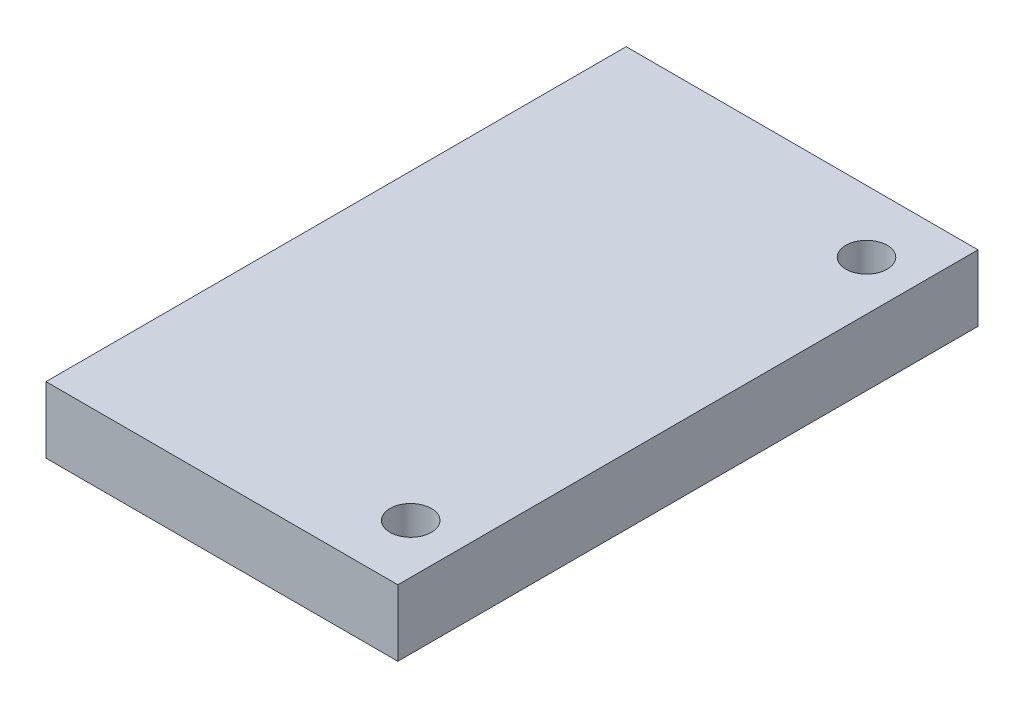
ISO-10303-21;
HEADER;
FILE_DESCRIPTION(('STEP AP214'),'2;1');
FILE_NAME('part.step','',(''),(''),'','','');
FILE_SCHEMA(('AUTOMOTIVE_DESIGN { 1 0 10303 214 1 1 1 1 }'));
ENDSEC;
DATA;
#1=APPLICATION_CONTEXT('core data for automotive mechanical design processes');
#2=APPLICATION_PROTOCOL_DEFINITION('international standard','automotive_design',2000,#1);
#3=PRODUCT_CONTEXT('',#1,'mechanical');
#4=PRODUCT('Part','Part','',(#3));
#5=PRODUCT_RELATED_PRODUCT_CATEGORY('part','',(#4));
#6=PRODUCT_DEFINITION_FORMATION('','',#4);
#7=PRODUCT_DEFINITION_CONTEXT('part definition',#1,'design');
#8=PRODUCT_DEFINITION('design','',#6,#7);
#9=PRODUCT_DEFINITION_SHAPE('','',#8);
#10=(LENGTH_UNIT() NAMED_UNIT(*) SI_UNIT(.MILLI.,.METRE.));
#11=(NAMED_UNIT(*) PLANE_ANGLE_UNIT() SI_UNIT($,.RADIAN.));
#12=(NAMED_UNIT(*) SI_UNIT($,.STERADIAN.) SOLID_ANGLE_UNIT());
#13=UNCERTAINTY_MEASURE_WITH_UNIT(LENGTH_MEASURE(1.E-05),#10,'distance_accuracy_value','');
#14=(GEOMETRIC_REPRESENTATION_CONTEXT(3) GLOBAL_UNCERTAINTY_ASSIGNED_CONTEXT((#13)) GLOBAL_UNIT_ASSIGNED_CONTEXT((#10,
#11,#12)) REPRESENTATION_CONTEXT('',''));
#15=CARTESIAN_POINT('',(0.,0.,0.));
#16=DIRECTION('',(0.,0.,1.));
#17=DIRECTION('',(1.,0.,0.));
#18=AXIS2_PLACEMENT_3D('',#15,#16,#17);
#19=CARTESIAN_POINT('',(0.,1.6,0.));
#20=DIRECTION('',(0.,1.,0.));
#21=DIRECTION('',(0.,0.,1.));
#22=AXIS2_PLACEMENT_3D('',#19,#20,#21);
#23=PLANE('',#22);
#24=CARTESIAN_POINT('',(-1.2,1.6,-5.5));
#25=DIRECTION('',(0.,1.,0.));
#26=DIRECTION('',(0.,0.,1.));
#27=AXIS2_PLACEMENT_3D('',#24,#25,#26);
#28=CIRCLE('',#27,0.5);
#29=CARTESIAN_POINT('',(-1.2,1.6,-5.));
#30=VERTEX_POINT('',#29);
#31=EDGE_CURVE('E114',#30,#30,#28,.T.);
#32=ORIENTED_EDGE('',*,*,#31,.F.);
#33=EDGE_LOOP('',(#32));
#34=FACE_BOUND('',#33,.T.);
#35=DIRECTION('',(0.,0.,1.));
#36=VECTOR('',#35,1.);
#37=CARTESIAN_POINT('',(-8.5,1.6,-7.));
#38=LINE('',#37,#36);
#39=CARTESIAN_POINT('',(-8.5,1.6,-7.));
#40=VERTEX_POINT('',#39);
#41=CARTESIAN_POINT('',(-8.5,1.6,7.));
#42=VERTEX_POINT('',#41);
#43=EDGE_CURVE('E94',#40,#42,#38,.T.);
#44=ORIENTED_EDGE('',*,*,#43,.T.);
#45=DIRECTION('',(1.,0.,0.));
#46=VECTOR('',#45,1.);
#47=CARTESIAN_POINT('',(-8.5,1.6,7.));
#48=LINE('',#47,#46);
#49=CARTESIAN_POINT('',(-0.00949609909211072,1.6,7.));
#50=VERTEX_POINT('',#49);
#51=EDGE_CURVE('E89',#42,#50,#48,.T.);
#52=ORIENTED_EDGE('',*,*,#51,.T.);
#53=DIRECTION('',(0.,0.,-1.));
#54=VECTOR('',#53,1.);
#55=CARTESIAN_POINT('',(-0.00949609909211072,1.6,-7.));
#56=LINE('',#55,#54);
#57=CARTESIAN_POINT('',(-0.00949609909211072,1.6,-7.));
#58=VERTEX_POINT('',#57);
#59=EDGE_CURVE('E92',#50,#58,#56,.T.);
#60=ORIENTED_EDGE('',*,*,#59,.T.);
#61=DIRECTION('',(-1.,0.,0.));
#62=VECTOR('',#61,1.);
#63=CARTESIAN_POINT('',(-8.5,1.6,-7.));
#64=LINE('',#63,#62);
#65=EDGE_CURVE('E59',#58,#40,#64,.T.);
#66=ORIENTED_EDGE('',*,*,#65,.T.);
#67=EDGE_LOOP('',(#44,#52,#60,#66));
#68=FACE_BOUND('',#67,.T.);
#69=CARTESIAN_POINT('',(-1.2,1.6,5.5));
#70=DIRECTION('',(0.,1.,0.));
#71=DIRECTION('',(0.,0.,1.));
#72=AXIS2_PLACEMENT_3D('',#69,#70,#71);
#73=CIRCLE('',#72,0.5);
#74=CARTESIAN_POINT('',(-1.2,1.6,6.));
#75=VERTEX_POINT('',#74);
#76=EDGE_CURVE('E136',#75,#75,#73,.T.);
#77=ORIENTED_EDGE('',*,*,#76,.F.);
#78=EDGE_LOOP('',(#77));
#79=FACE_BOUND('',#78,.T.);
#80=ADVANCED_FACE('F41',(#34,#68,#79),#23,.T.);
#81=CARTESIAN_POINT('',(0.,0.,0.));
#82=DIRECTION('',(0.,1.,0.));
#83=DIRECTION('',(0.,0.,1.));
#84=AXIS2_PLACEMENT_3D('',#81,#82,#83);
#85=PLANE('',#84);
#86=DIRECTION('',(0.,0.,1.));
#87=VECTOR('',#86,1.);
#88=CARTESIAN_POINT('',(-8.5,0.,-7.));
#89=LINE('',#88,#87);
#90=CARTESIAN_POINT('',(-8.5,0.,-7.));
#91=VERTEX_POINT('',#90);
#92=CARTESIAN_POINT('',(-8.5,0.,7.));
#93=VERTEX_POINT('',#92);
#94=EDGE_CURVE('E110',#91,#93,#89,.T.);
#95=ORIENTED_EDGE('',*,*,#94,.F.);
#96=DIRECTION('',(-1.,0.,0.));
#97=VECTOR('',#96,1.);
#98=CARTESIAN_POINT('',(-8.5,0.,-7.));
#99=LINE('',#98,#97);
#100=CARTESIAN_POINT('',(-0.00949609909211072,0.,-7.));
#101=VERTEX_POINT('',#100);
#102=EDGE_CURVE('E82',#101,#91,#99,.T.);
#103=ORIENTED_EDGE('',*,*,#102,.F.);
#104=DIRECTION('',(0.,0.,-1.));
#105=VECTOR('',#104,1.);
#106=CARTESIAN_POINT('',(-0.00949609909211072,0.,-7.));
#107=LINE('',#106,#105);
#108=CARTESIAN_POINT('',(-0.00949609909211072,0.,7.));
#109=VERTEX_POINT('',#108);
#110=EDGE_CURVE('E76',#109,#101,#107,.T.);
#111=ORIENTED_EDGE('',*,*,#110,.F.);
#112=DIRECTION('',(1.,0.,0.));
#113=VECTOR('',#112,1.);
#114=CARTESIAN_POINT('',(-8.5,0.,7.));
#115=LINE('',#114,#113);
#116=EDGE_CURVE('E99',#93,#109,#115,.T.);
#117=ORIENTED_EDGE('',*,*,#116,.F.);
#118=EDGE_LOOP('',(#95,#103,#111,#117));
#119=FACE_BOUND('',#118,.T.);
#120=CARTESIAN_POINT('',(-1.2,0.,-5.5));
#121=DIRECTION('',(0.,1.,0.));
#122=DIRECTION('',(0.,0.,1.));
#123=AXIS2_PLACEMENT_3D('',#120,#121,#122);
#124=CIRCLE('',#123,0.5);
#125=CARTESIAN_POINT('',(-1.2,0.,-5.));
#126=VERTEX_POINT('',#125);
#127=EDGE_CURVE('E132',#126,#126,#124,.T.);
#128=ORIENTED_EDGE('',*,*,#127,.T.);
#129=EDGE_LOOP('',(#128));
#130=FACE_BOUND('',#129,.T.);
#131=CARTESIAN_POINT('',(-1.2,0.,5.5));
#132=DIRECTION('',(0.,1.,0.));
#133=DIRECTION('',(0.,0.,1.));
#134=AXIS2_PLACEMENT_3D('',#131,#132,#133);
#135=CIRCLE('',#134,0.5);
#136=CARTESIAN_POINT('',(-1.2,0.,6.));
#137=VERTEX_POINT('',#136);
#138=EDGE_CURVE('E140',#137,#137,#135,.T.);
#139=ORIENTED_EDGE('',*,*,#138,.T.);
#140=EDGE_LOOP('',(#139));
#141=FACE_BOUND('',#140,.T.);
#142=ADVANCED_FACE('F127',(#119,#130,#141),#85,.F.);
#143=CARTESIAN_POINT('',(-8.5,1.6,-7.));
#144=DIRECTION('',(1.,0.,0.));
#145=DIRECTION('',(0.,0.,-1.));
#146=AXIS2_PLACEMENT_3D('',#143,#144,#145);
#147=PLANE('',#146);
#148=ORIENTED_EDGE('',*,*,#94,.T.);
#149=DIRECTION('',(0.,-1.,0.));
#150=VECTOR('',#149,1.);
#151=CARTESIAN_POINT('',(-8.5,1.6,7.));
#152=LINE('',#151,#150);
#153=EDGE_CURVE('E11',#42,#93,#152,.T.);
#154=ORIENTED_EDGE('',*,*,#153,.F.);
#155=ORIENTED_EDGE('',*,*,#43,.F.);
#156=DIRECTION('',(0.,-1.,0.));
#157=VECTOR('',#156,1.);
#158=CARTESIAN_POINT('',(-8.5,1.6,-7.));
#159=LINE('',#158,#157);
#160=EDGE_CURVE('E106',#40,#91,#159,.T.);
#161=ORIENTED_EDGE('',*,*,#160,.T.);
#162=EDGE_LOOP('',(#148,#154,#155,#161));
#163=FACE_BOUND('',#162,.T.);
#164=ADVANCED_FACE('F43',(#163),#147,.F.);
#165=CARTESIAN_POINT('',(-8.5,1.6,7.));
#166=DIRECTION('',(0.,0.,-1.));
#167=DIRECTION('',(-1.,0.,0.));
#168=AXIS2_PLACEMENT_3D('',#165,#166,#167);
#169=PLANE('',#168);
#170=ORIENTED_EDGE('',*,*,#116,.T.);
#171=DIRECTION('',(0.,-1.,0.));
#172=VECTOR('',#171,1.);
#173=CARTESIAN_POINT('',(-0.00949609909211072,1.6,7.));
#174=LINE('',#173,#172);
#175=EDGE_CURVE('E51',#50,#109,#174,.T.);
#176=ORIENTED_EDGE('',*,*,#175,.F.);
#177=ORIENTED_EDGE('',*,*,#51,.F.);
#178=ORIENTED_EDGE('',*,*,#153,.T.);
#179=EDGE_LOOP('',(#170,#176,#177,#178));
#180=FACE_BOUND('',#179,.T.);
#181=ADVANCED_FACE('F98',(#180),#169,.F.);
#182=CARTESIAN_POINT('',(-0.00949609909211072,1.6,-7.));
#183=DIRECTION('',(-1.,0.,0.));
#184=DIRECTION('',(0.,0.,1.));
#185=AXIS2_PLACEMENT_3D('',#182,#183,#184);
#186=PLANE('',#185);
#187=ORIENTED_EDGE('',*,*,#110,.T.);
#188=DIRECTION('',(0.,-1.,0.));
#189=VECTOR('',#188,1.);
#190=CARTESIAN_POINT('',(-0.00949609909211072,1.6,-7.));
#191=LINE('',#190,#189);
#192=EDGE_CURVE('E101',#58,#101,#191,.T.);
#193=ORIENTED_EDGE('',*,*,#192,.F.);
#194=ORIENTED_EDGE('',*,*,#59,.F.);
#195=ORIENTED_EDGE('',*,*,#175,.T.);
#196=EDGE_LOOP('',(#187,#193,#194,#195));
#197=FACE_BOUND('',#196,.T.);
#198=ADVANCED_FACE('F102',(#197),#186,.F.);
#199=CARTESIAN_POINT('',(-8.5,1.6,-7.));
#200=DIRECTION('',(0.,0.,1.));
#201=DIRECTION('',(1.,0.,0.));
#202=AXIS2_PLACEMENT_3D('',#199,#200,#201);
#203=PLANE('',#202);
#204=ORIENTED_EDGE('',*,*,#102,.T.);
#205=ORIENTED_EDGE('',*,*,#160,.F.);
#206=ORIENTED_EDGE('',*,*,#65,.F.);
#207=ORIENTED_EDGE('',*,*,#192,.T.);
#208=EDGE_LOOP('',(#204,#205,#206,#207));
#209=FACE_BOUND('',#208,.T.);
#210=ADVANCED_FACE('F124',(#209),#203,.F.);
#211=CARTESIAN_POINT('',(-1.2,1.6,-5.5));
#212=DIRECTION('',(0.,-1.,0.));
#213=DIRECTION('',(0.,0.,-1.));
#214=AXIS2_PLACEMENT_3D('',#211,#212,#213);
#215=CYLINDRICAL_SURFACE('',#214,0.5);
#216=ORIENTED_EDGE('',*,*,#31,.T.);
#217=EDGE_LOOP('',(#216));
#218=FACE_BOUND('',#217,.T.);
#219=ORIENTED_EDGE('',*,*,#127,.F.);
#220=EDGE_LOOP('',(#219));
#221=FACE_BOUND('',#220,.T.);
#222=ADVANCED_FACE('F159',(#218,#221),#215,.F.);
#223=CARTESIAN_POINT('',(-1.2,1.6,5.5));
#224=DIRECTION('',(0.,-1.,0.));
#225=DIRECTION('',(0.,0.,-1.));
#226=AXIS2_PLACEMENT_3D('',#223,#224,#225);
#227=CYLINDRICAL_SURFACE('',#226,0.5);
#228=ORIENTED_EDGE('',*,*,#76,.T.);
#229=EDGE_LOOP('',(#228));
#230=FACE_BOUND('',#229,.T.);
#231=ORIENTED_EDGE('',*,*,#138,.F.);
#232=EDGE_LOOP('',(#231));
#233=FACE_BOUND('',#232,.T.);
#234=ADVANCED_FACE('F148',(#230,#233),#227,.F.);
#235=CLOSED_SHELL('',(#80,#142,#164,#181,#198,#210,#222,#234));
#236=MANIFOLD_SOLID_BREP('B2',#235);
#237=ADVANCED_BREP_SHAPE_REPRESENTATION('',(#18,#236),#14);
#238=SHAPE_DEFINITION_REPRESENTATION(#9,#237);
ENDSEC;
END-ISO-10303-21;
